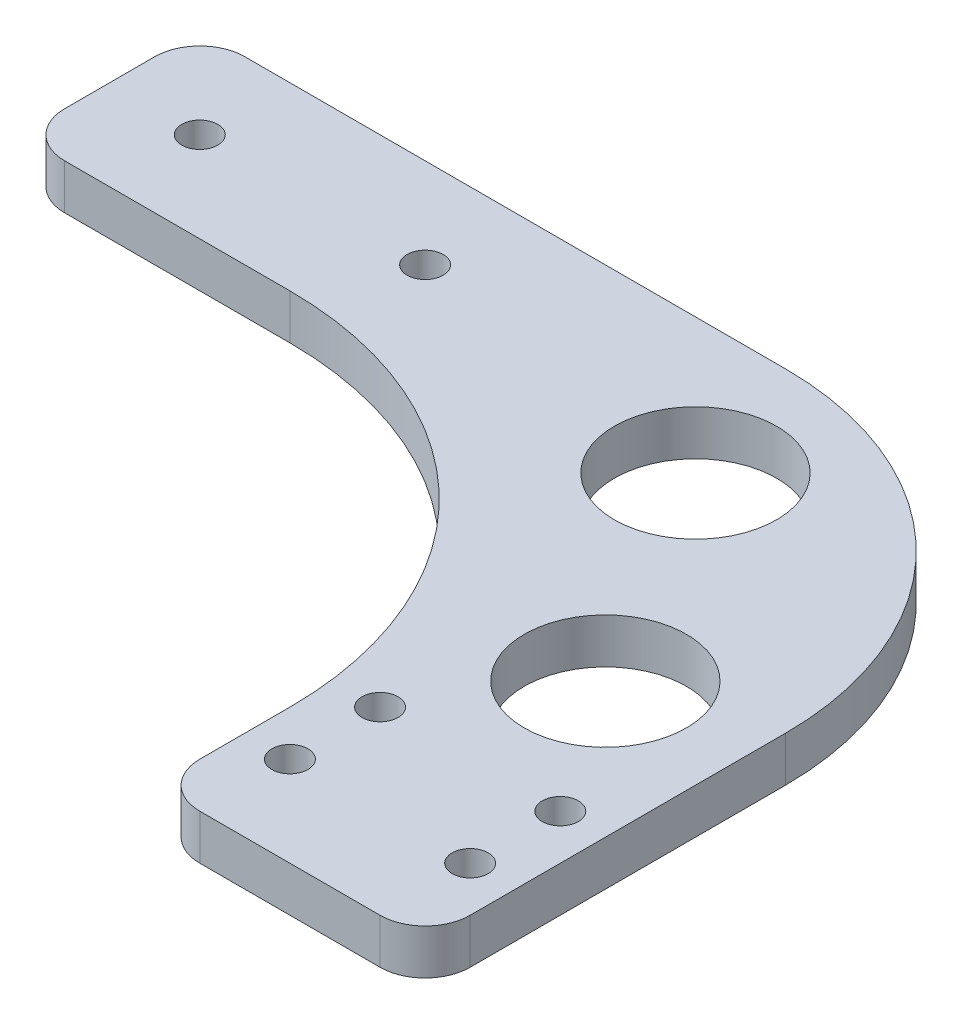
ISO-10303-21;
HEADER;
FILE_DESCRIPTION(('STEP AP214'),'2;1');
FILE_NAME('part.step','',(''),(''),'','','');
FILE_SCHEMA(('AUTOMOTIVE_DESIGN { 1 0 10303 214 1 1 1 1 }'));
ENDSEC;
DATA;
#1=APPLICATION_CONTEXT('core data for automotive mechanical design processes');
#2=APPLICATION_PROTOCOL_DEFINITION('international standard','automotive_design',2000,#1);
#3=PRODUCT_CONTEXT('',#1,'mechanical');
#4=PRODUCT('Part','Part','',(#3));
#5=PRODUCT_RELATED_PRODUCT_CATEGORY('part','',(#4));
#6=PRODUCT_DEFINITION_FORMATION('','',#4);
#7=PRODUCT_DEFINITION_CONTEXT('part definition',#1,'design');
#8=PRODUCT_DEFINITION('design','',#6,#7);
#9=PRODUCT_DEFINITION_SHAPE('','',#8);
#10=(LENGTH_UNIT() NAMED_UNIT(*) SI_UNIT(.MILLI.,.METRE.));
#11=(NAMED_UNIT(*) PLANE_ANGLE_UNIT() SI_UNIT($,.RADIAN.));
#12=(NAMED_UNIT(*) SI_UNIT($,.STERADIAN.) SOLID_ANGLE_UNIT());
#13=UNCERTAINTY_MEASURE_WITH_UNIT(LENGTH_MEASURE(1.E-05),#10,'distance_accuracy_value','');
#14=(GEOMETRIC_REPRESENTATION_CONTEXT(3) GLOBAL_UNCERTAINTY_ASSIGNED_CONTEXT((#13)) GLOBAL_UNIT_ASSIGNED_CONTEXT((#10,
#11,#12)) REPRESENTATION_CONTEXT('',''));
#15=CARTESIAN_POINT('',(0.,0.,0.));
#16=DIRECTION('',(0.,0.,1.));
#17=DIRECTION('',(1.,0.,0.));
#18=AXIS2_PLACEMENT_3D('',#15,#16,#17);
#19=CARTESIAN_POINT('',(-89.6250000000001,5.,-15.375));
#20=DIRECTION('',(1.,0.,0.));
#21=DIRECTION('',(0.,0.,-1.));
#22=AXIS2_PLACEMENT_3D('',#19,#20,#21);
#23=PLANE('',#22);
#24=DIRECTION('',(0.,0.,1.));
#25=VECTOR('',#24,1.);
#26=CARTESIAN_POINT('',(-89.6250000000001,5.,-15.375));
#27=LINE('',#26,#25);
#28=CARTESIAN_POINT('',(-89.6250000000001,5.,-30.375));
#29=VERTEX_POINT('',#28);
#30=CARTESIAN_POINT('',(-89.6250000000001,5.,-20.375));
#31=VERTEX_POINT('',#30);
#32=EDGE_CURVE('E175',#29,#31,#27,.T.);
#33=ORIENTED_EDGE('',*,*,#32,.F.);
#34=DIRECTION('',(0.,-1.,0.));
#35=VECTOR('',#34,1.);
#36=CARTESIAN_POINT('',(-89.6250000000001,5.,-30.375));
#37=LINE('',#36,#35);
#38=CARTESIAN_POINT('',(-89.6250000000001,0.,-30.375));
#39=VERTEX_POINT('',#38);
#40=EDGE_CURVE('E222',#29,#39,#37,.T.);
#41=ORIENTED_EDGE('',*,*,#40,.T.);
#42=DIRECTION('',(0.,0.,1.));
#43=VECTOR('',#42,1.);
#44=CARTESIAN_POINT('',(-89.6250000000001,0.,-15.375));
#45=LINE('',#44,#43);
#46=CARTESIAN_POINT('',(-89.6250000000001,0.,-20.375));
#47=VERTEX_POINT('',#46);
#48=EDGE_CURVE('E167',#39,#47,#45,.T.);
#49=ORIENTED_EDGE('',*,*,#48,.T.);
#50=DIRECTION('',(0.,-1.,0.));
#51=VECTOR('',#50,1.);
#52=CARTESIAN_POINT('',(-89.6250000000001,5.,-20.375));
#53=LINE('',#52,#51);
#54=EDGE_CURVE('E219',#47,#31,#53,.F.);
#55=ORIENTED_EDGE('',*,*,#54,.T.);
#56=EDGE_LOOP('',(#33,#41,#49,#55));
#57=FACE_BOUND('',#56,.T.);
#58=ADVANCED_FACE('F41',(#57),#23,.F.);
#59=CARTESIAN_POINT('',(-19.6250000000001,5.,-15.375));
#60=DIRECTION('',(0.,0.,-1.));
#61=DIRECTION('',(-1.,0.,0.));
#62=AXIS2_PLACEMENT_3D('',#59,#60,#61);
#63=PLANE('',#62);
#64=DIRECTION('',(1.,0.,0.));
#65=VECTOR('',#64,1.);
#66=CARTESIAN_POINT('',(-19.6250000000001,5.,-15.375));
#67=LINE('',#66,#65);
#68=CARTESIAN_POINT('',(-84.6250000000001,5.,-15.375));
#69=VERTEX_POINT('',#68);
#70=CARTESIAN_POINT('',(-59.6250000000001,5.,-15.375));
#71=VERTEX_POINT('',#70);
#72=EDGE_CURVE('E251',#69,#71,#67,.T.);
#73=ORIENTED_EDGE('',*,*,#72,.F.);
#74=DIRECTION('',(0.,-1.,0.));
#75=VECTOR('',#74,1.);
#76=CARTESIAN_POINT('',(-84.6250000000001,5.,-15.375));
#77=LINE('',#76,#75);
#78=CARTESIAN_POINT('',(-84.6250000000001,0.,-15.375));
#79=VERTEX_POINT('',#78);
#80=EDGE_CURVE('E230',#69,#79,#77,.T.);
#81=ORIENTED_EDGE('',*,*,#80,.T.);
#82=DIRECTION('',(1.,0.,0.));
#83=VECTOR('',#82,1.);
#84=CARTESIAN_POINT('',(-19.6250000000001,0.,-15.375));
#85=LINE('',#84,#83);
#86=CARTESIAN_POINT('',(-59.6250000000001,0.,-15.375));
#87=VERTEX_POINT('',#86);
#88=EDGE_CURVE('E160',#79,#87,#85,.T.);
#89=ORIENTED_EDGE('',*,*,#88,.T.);
#90=DIRECTION('',(0.,-1.,0.));
#91=VECTOR('',#90,1.);
#92=CARTESIAN_POINT('',(-59.6250000000001,5.,-15.375));
#93=LINE('',#92,#91);
#94=EDGE_CURVE('E138',#87,#71,#93,.F.);
#95=ORIENTED_EDGE('',*,*,#94,.T.);
#96=EDGE_LOOP('',(#73,#81,#89,#95));
#97=FACE_BOUND('',#96,.T.);
#98=ADVANCED_FACE('F377',(#97),#63,.F.);
#99=CARTESIAN_POINT('',(-19.6250000000001,5.,39.625));
#100=DIRECTION('',(1.,0.,0.));
#101=DIRECTION('',(0.,0.,-1.));
#102=AXIS2_PLACEMENT_3D('',#99,#100,#101);
#103=PLANE('',#102);
#104=DIRECTION('',(0.,0.,1.));
#105=VECTOR('',#104,1.);
#106=CARTESIAN_POINT('',(-19.6250000000001,0.,39.625));
#107=LINE('',#106,#105);
#108=CARTESIAN_POINT('',(-19.6250000000001,0.,24.625));
#109=VERTEX_POINT('',#108);
#110=CARTESIAN_POINT('',(-19.6250000000001,0.,34.625));
#111=VERTEX_POINT('',#110);
#112=EDGE_CURVE('E148',#109,#111,#107,.T.);
#113=ORIENTED_EDGE('',*,*,#112,.T.);
#114=DIRECTION('',(0.,-1.,0.));
#115=VECTOR('',#114,1.);
#116=CARTESIAN_POINT('',(-19.6250000000001,5.,34.625));
#117=LINE('',#116,#115);
#118=CARTESIAN_POINT('',(-19.6250000000001,5.,34.625));
#119=VERTEX_POINT('',#118);
#120=EDGE_CURVE('E216',#111,#119,#117,.F.);
#121=ORIENTED_EDGE('',*,*,#120,.T.);
#122=DIRECTION('',(0.,0.,1.));
#123=VECTOR('',#122,1.);
#124=CARTESIAN_POINT('',(-19.6250000000001,5.,39.625));
#125=LINE('',#124,#123);
#126=CARTESIAN_POINT('',(-19.6250000000001,5.,24.625));
#127=VERTEX_POINT('',#126);
#128=EDGE_CURVE('E151',#127,#119,#125,.T.);
#129=ORIENTED_EDGE('',*,*,#128,.F.);
#130=DIRECTION('',(0.,-1.,0.));
#131=VECTOR('',#130,1.);
#132=CARTESIAN_POINT('',(-19.6250000000001,0.,24.625));
#133=LINE('',#132,#131);
#134=EDGE_CURVE('E136',#127,#109,#133,.T.);
#135=ORIENTED_EDGE('',*,*,#134,.T.);
#136=EDGE_LOOP('',(#113,#121,#129,#135));
#137=FACE_BOUND('',#136,.T.);
#138=ADVANCED_FACE('F147',(#137),#103,.F.);
#139=CARTESIAN_POINT('',(10.3749999999999,5.,39.625));
#140=DIRECTION('',(0.,0.,-1.));
#141=DIRECTION('',(-1.,0.,0.));
#142=AXIS2_PLACEMENT_3D('',#139,#140,#141);
#143=PLANE('',#142);
#144=DIRECTION('',(1.,0.,0.));
#145=VECTOR('',#144,1.);
#146=CARTESIAN_POINT('',(10.3749999999999,0.,39.625));
#147=LINE('',#146,#145);
#148=CARTESIAN_POINT('',(-14.6250000000001,0.,39.625));
#149=VERTEX_POINT('',#148);
#150=CARTESIAN_POINT('',(5.37499999999991,0.,39.625));
#151=VERTEX_POINT('',#150);
#152=EDGE_CURVE('E159',#149,#151,#147,.T.);
#153=ORIENTED_EDGE('',*,*,#152,.T.);
#154=DIRECTION('',(0.,-1.,0.));
#155=VECTOR('',#154,1.);
#156=CARTESIAN_POINT('',(5.37499999999991,5.,39.625));
#157=LINE('',#156,#155);
#158=CARTESIAN_POINT('',(5.37499999999991,5.,39.625));
#159=VERTEX_POINT('',#158);
#160=EDGE_CURVE('E201',#151,#159,#157,.F.);
#161=ORIENTED_EDGE('',*,*,#160,.T.);
#162=DIRECTION('',(1.,0.,0.));
#163=VECTOR('',#162,1.);
#164=CARTESIAN_POINT('',(10.3749999999999,5.,39.625));
#165=LINE('',#164,#163);
#166=CARTESIAN_POINT('',(-14.6250000000001,5.,39.625));
#167=VERTEX_POINT('',#166);
#168=EDGE_CURVE('E245',#167,#159,#165,.T.);
#169=ORIENTED_EDGE('',*,*,#168,.F.);
#170=DIRECTION('',(0.,-1.,0.));
#171=VECTOR('',#170,1.);
#172=CARTESIAN_POINT('',(-14.6250000000001,5.,39.625));
#173=LINE('',#172,#171);
#174=EDGE_CURVE('E197',#167,#149,#173,.T.);
#175=ORIENTED_EDGE('',*,*,#174,.T.);
#176=EDGE_LOOP('',(#153,#161,#169,#175));
#177=FACE_BOUND('',#176,.T.);
#178=ADVANCED_FACE('F384',(#177),#143,.F.);
#179=CARTESIAN_POINT('',(10.3749999999999,5.,-35.375));
#180=DIRECTION('',(-1.,0.,0.));
#181=DIRECTION('',(0.,0.,1.));
#182=AXIS2_PLACEMENT_3D('',#179,#180,#181);
#183=PLANE('',#182);
#184=DIRECTION('',(0.,0.,-1.));
#185=VECTOR('',#184,1.);
#186=CARTESIAN_POINT('',(10.3749999999999,0.,-35.375));
#187=LINE('',#186,#185);
#188=CARTESIAN_POINT('',(10.3749999999999,0.,34.625));
#189=VERTEX_POINT('',#188);
#190=CARTESIAN_POINT('',(10.3749999999999,0.,-0.375000000000007));
#191=VERTEX_POINT('',#190);
#192=EDGE_CURVE('E165',#189,#191,#187,.T.);
#193=ORIENTED_EDGE('',*,*,#192,.T.);
#194=DIRECTION('',(0.,-1.,0.));
#195=VECTOR('',#194,1.);
#196=CARTESIAN_POINT('',(10.3749999999999,5.,-0.375000000000007));
#197=LINE('',#196,#195);
#198=CARTESIAN_POINT('',(10.3749999999999,5.,-0.375000000000007));
#199=VERTEX_POINT('',#198);
#200=EDGE_CURVE('E50',#191,#199,#197,.F.);
#201=ORIENTED_EDGE('',*,*,#200,.T.);
#202=DIRECTION('',(0.,0.,-1.));
#203=VECTOR('',#202,1.);
#204=CARTESIAN_POINT('',(10.3749999999999,5.,-35.375));
#205=LINE('',#204,#203);
#206=CARTESIAN_POINT('',(10.3749999999999,5.,34.625));
#207=VERTEX_POINT('',#206);
#208=EDGE_CURVE('E242',#207,#199,#205,.T.);
#209=ORIENTED_EDGE('',*,*,#208,.F.);
#210=DIRECTION('',(0.,-1.,0.));
#211=VECTOR('',#210,1.);
#212=CARTESIAN_POINT('',(10.3749999999999,5.,34.625));
#213=LINE('',#212,#211);
#214=EDGE_CURVE('E181',#207,#189,#213,.T.);
#215=ORIENTED_EDGE('',*,*,#214,.T.);
#216=EDGE_LOOP('',(#193,#201,#209,#215));
#217=FACE_BOUND('',#216,.T.);
#218=ADVANCED_FACE('F388',(#217),#183,.F.);
#219=CARTESIAN_POINT('',(-89.6250000000001,5.,-35.375));
#220=DIRECTION('',(0.,0.,1.));
#221=DIRECTION('',(1.,0.,0.));
#222=AXIS2_PLACEMENT_3D('',#219,#220,#221);
#223=PLANE('',#222);
#224=DIRECTION('',(-1.,0.,0.));
#225=VECTOR('',#224,1.);
#226=CARTESIAN_POINT('',(-89.6250000000001,5.,-35.375));
#227=LINE('',#226,#225);
#228=CARTESIAN_POINT('',(-24.6250000000001,5.,-35.375));
#229=VERTEX_POINT('',#228);
#230=CARTESIAN_POINT('',(-84.6250000000001,5.,-35.375));
#231=VERTEX_POINT('',#230);
#232=EDGE_CURVE('E153',#229,#231,#227,.T.);
#233=ORIENTED_EDGE('',*,*,#232,.F.);
#234=DIRECTION('',(0.,-1.,0.));
#235=VECTOR('',#234,1.);
#236=CARTESIAN_POINT('',(-24.6250000000001,5.,-35.375));
#237=LINE('',#236,#235);
#238=CARTESIAN_POINT('',(-24.6250000000001,0.,-35.375));
#239=VERTEX_POINT('',#238);
#240=EDGE_CURVE('E234',#229,#239,#237,.T.);
#241=ORIENTED_EDGE('',*,*,#240,.T.);
#242=DIRECTION('',(-1.,0.,0.));
#243=VECTOR('',#242,1.);
#244=CARTESIAN_POINT('',(-89.6250000000001,0.,-35.375));
#245=LINE('',#244,#243);
#246=CARTESIAN_POINT('',(-84.6250000000001,0.,-35.375));
#247=VERTEX_POINT('',#246);
#248=EDGE_CURVE('E173',#239,#247,#245,.T.);
#249=ORIENTED_EDGE('',*,*,#248,.T.);
#250=DIRECTION('',(0.,-1.,0.));
#251=VECTOR('',#250,1.);
#252=CARTESIAN_POINT('',(-84.6250000000001,5.,-35.375));
#253=LINE('',#252,#251);
#254=EDGE_CURVE('E226',#247,#231,#253,.F.);
#255=ORIENTED_EDGE('',*,*,#254,.T.);
#256=EDGE_LOOP('',(#233,#241,#249,#255));
#257=FACE_BOUND('',#256,.T.);
#258=ADVANCED_FACE('F345',(#257),#223,.F.);
#259=CARTESIAN_POINT('',(0.,5.,0.));
#260=DIRECTION('',(0.,-1.,0.));
#261=DIRECTION('',(0.,0.,-1.));
#262=AXIS2_PLACEMENT_3D('',#259,#260,#261);
#263=PLANE('',#262);
#264=CARTESIAN_POINT('',(-54.6250000000001,5.,-25.375));
#265=DIRECTION('',(0.,1.,0.));
#266=DIRECTION('',(0.,0.,1.));
#267=AXIS2_PLACEMENT_3D('',#264,#265,#266);
#268=CIRCLE('',#267,2.);
#269=CARTESIAN_POINT('',(-54.6250000000001,5.,-23.375));
#270=VERTEX_POINT('',#269);
#271=EDGE_CURVE('E325',#270,#270,#268,.T.);
#272=ORIENTED_EDGE('',*,*,#271,.F.);
#273=EDGE_LOOP('',(#272));
#274=FACE_BOUND('',#273,.T.);
#275=CARTESIAN_POINT('',(-79.6250000000001,5.,-25.375));
#276=DIRECTION('',(0.,1.,0.));
#277=DIRECTION('',(0.,0.,1.));
#278=AXIS2_PLACEMENT_3D('',#275,#276,#277);
#279=CIRCLE('',#278,2.);
#280=CARTESIAN_POINT('',(-79.6250000000001,5.,-23.375));
#281=VERTEX_POINT('',#280);
#282=EDGE_CURVE('E317',#281,#281,#279,.T.);
#283=ORIENTED_EDGE('',*,*,#282,.F.);
#284=EDGE_LOOP('',(#283));
#285=FACE_BOUND('',#284,.T.);
#286=CARTESIAN_POINT('',(-4.62500000000009,5.,4.62499999999998));
#287=DIRECTION('',(0.,1.,0.));
#288=DIRECTION('',(0.,0.,1.));
#289=AXIS2_PLACEMENT_3D('',#286,#287,#288);
#290=CIRCLE('',#289,9.);
#291=CARTESIAN_POINT('',(-4.62500000000009,5.,13.625));
#292=VERTEX_POINT('',#291);
#293=EDGE_CURVE('E309',#292,#292,#290,.T.);
#294=ORIENTED_EDGE('',*,*,#293,.F.);
#295=EDGE_LOOP('',(#294));
#296=FACE_BOUND('',#295,.T.);
#297=CARTESIAN_POINT('',(-19.6250000000001,5.,-20.375));
#298=DIRECTION('',(0.,1.,0.));
#299=DIRECTION('',(0.,0.,1.));
#300=AXIS2_PLACEMENT_3D('',#297,#298,#299);
#301=CIRCLE('',#300,9.);
#302=CARTESIAN_POINT('',(-19.6250000000001,5.,-11.375));
#303=VERTEX_POINT('',#302);
#304=EDGE_CURVE('E301',#303,#303,#301,.T.);
#305=ORIENTED_EDGE('',*,*,#304,.F.);
#306=EDGE_LOOP('',(#305));
#307=FACE_BOUND('',#306,.T.);
#308=CARTESIAN_POINT('',(5.37499999999991,5.,29.625));
#309=DIRECTION('',(0.,1.,0.));
#310=DIRECTION('',(0.,0.,1.));
#311=AXIS2_PLACEMENT_3D('',#308,#309,#310);
#312=CIRCLE('',#311,2.);
#313=CARTESIAN_POINT('',(5.37499999999991,5.,31.625));
#314=VERTEX_POINT('',#313);
#315=EDGE_CURVE('E294',#314,#314,#312,.T.);
#316=ORIENTED_EDGE('',*,*,#315,.F.);
#317=EDGE_LOOP('',(#316));
#318=FACE_BOUND('',#317,.T.);
#319=CARTESIAN_POINT('',(5.3749999999999,5.,19.625));
#320=DIRECTION('',(0.,1.,0.));
#321=DIRECTION('',(0.,0.,1.));
#322=AXIS2_PLACEMENT_3D('',#319,#320,#321);
#323=CIRCLE('',#322,2.);
#324=CARTESIAN_POINT('',(5.3749999999999,5.,21.625));
#325=VERTEX_POINT('',#324);
#326=EDGE_CURVE('E286',#325,#325,#323,.T.);
#327=ORIENTED_EDGE('',*,*,#326,.F.);
#328=EDGE_LOOP('',(#327));
#329=FACE_BOUND('',#328,.T.);
#330=CARTESIAN_POINT('',(-14.6250000000001,5.,19.625));
#331=DIRECTION('',(0.,1.,0.));
#332=DIRECTION('',(0.,0.,1.));
#333=AXIS2_PLACEMENT_3D('',#330,#331,#332);
#334=CIRCLE('',#333,2.);
#335=CARTESIAN_POINT('',(-14.6250000000001,5.,21.625));
#336=VERTEX_POINT('',#335);
#337=EDGE_CURVE('E277',#336,#336,#334,.T.);
#338=ORIENTED_EDGE('',*,*,#337,.F.);
#339=EDGE_LOOP('',(#338));
#340=FACE_BOUND('',#339,.T.);
#341=CARTESIAN_POINT('',(-14.6250000000001,5.,29.625));
#342=DIRECTION('',(0.,1.,0.));
#343=DIRECTION('',(0.,0.,1.));
#344=AXIS2_PLACEMENT_3D('',#341,#342,#343);
#345=CIRCLE('',#344,2.);
#346=CARTESIAN_POINT('',(-14.6250000000001,5.,31.625));
#347=VERTEX_POINT('',#346);
#348=EDGE_CURVE('E261',#347,#347,#345,.T.);
#349=ORIENTED_EDGE('',*,*,#348,.F.);
#350=EDGE_LOOP('',(#349));
#351=FACE_BOUND('',#350,.T.);
#352=ORIENTED_EDGE('',*,*,#208,.T.);
#353=CARTESIAN_POINT('',(-24.6250000000001,5.,-0.375));
#354=DIRECTION('',(0.,-1.,0.));
#355=DIRECTION('',(0.,0.,-1.));
#356=AXIS2_PLACEMENT_3D('',#353,#354,#355);
#357=CIRCLE('',#356,35.);
#358=EDGE_CURVE('E11',#199,#229,#357,.F.);
#359=ORIENTED_EDGE('',*,*,#358,.T.);
#360=ORIENTED_EDGE('',*,*,#232,.T.);
#361=CARTESIAN_POINT('',(-84.6250000000001,5.,-30.375));
#362=DIRECTION('',(0.,-1.,0.));
#363=DIRECTION('',(0.,0.,-1.));
#364=AXIS2_PLACEMENT_3D('',#361,#362,#363);
#365=CIRCLE('',#364,5.);
#366=EDGE_CURVE('E207',#231,#29,#365,.F.);
#367=ORIENTED_EDGE('',*,*,#366,.T.);
#368=ORIENTED_EDGE('',*,*,#32,.T.);
#369=CARTESIAN_POINT('',(-84.6250000000001,5.,-20.375));
#370=DIRECTION('',(0.,-1.,0.));
#371=DIRECTION('',(0.,0.,-1.));
#372=AXIS2_PLACEMENT_3D('',#369,#370,#371);
#373=CIRCLE('',#372,5.);
#374=EDGE_CURVE('E204',#31,#69,#373,.F.);
#375=ORIENTED_EDGE('',*,*,#374,.T.);
#376=ORIENTED_EDGE('',*,*,#72,.T.);
#377=CARTESIAN_POINT('',(-59.6250000000001,5.,24.625));
#378=DIRECTION('',(0.,-1.,0.));
#379=DIRECTION('',(0.,0.,-1.));
#380=AXIS2_PLACEMENT_3D('',#377,#378,#379);
#381=CIRCLE('',#380,40.);
#382=EDGE_CURVE('E142',#71,#127,#381,.T.);
#383=ORIENTED_EDGE('',*,*,#382,.T.);
#384=ORIENTED_EDGE('',*,*,#128,.T.);
#385=CARTESIAN_POINT('',(-14.6250000000001,5.,34.625));
#386=DIRECTION('',(0.,-1.,0.));
#387=DIRECTION('',(0.,0.,-1.));
#388=AXIS2_PLACEMENT_3D('',#385,#386,#387);
#389=CIRCLE('',#388,5.);
#390=EDGE_CURVE('E210',#119,#167,#389,.F.);
#391=ORIENTED_EDGE('',*,*,#390,.T.);
#392=ORIENTED_EDGE('',*,*,#168,.T.);
#393=CARTESIAN_POINT('',(5.37499999999991,5.,34.625));
#394=DIRECTION('',(0.,-1.,0.));
#395=DIRECTION('',(0.,0.,-1.));
#396=AXIS2_PLACEMENT_3D('',#393,#394,#395);
#397=CIRCLE('',#396,5.);
#398=EDGE_CURVE('E213',#159,#207,#397,.F.);
#399=ORIENTED_EDGE('',*,*,#398,.T.);
#400=EDGE_LOOP('',(#352,#359,#360,#367,#368,#375,#376,#383,#384,#391,#392,#399));
#401=FACE_BOUND('',#400,.T.);
#402=ADVANCED_FACE('F342',(#274,#285,#296,#307,#318,#329,#340,#351,#401),#263,.F.);
#403=CARTESIAN_POINT('',(0.,0.,0.));
#404=DIRECTION('',(0.,-1.,0.));
#405=DIRECTION('',(0.,0.,-1.));
#406=AXIS2_PLACEMENT_3D('',#403,#404,#405);
#407=PLANE('',#406);
#408=CARTESIAN_POINT('',(-54.6250000000001,0.,-25.375));
#409=DIRECTION('',(0.,1.,0.));
#410=DIRECTION('',(0.,0.,1.));
#411=AXIS2_PLACEMENT_3D('',#408,#409,#410);
#412=CIRCLE('',#411,2.);
#413=CARTESIAN_POINT('',(-54.6250000000001,0.,-23.375));
#414=VERTEX_POINT('',#413);
#415=EDGE_CURVE('E321',#414,#414,#412,.T.);
#416=ORIENTED_EDGE('',*,*,#415,.T.);
#417=EDGE_LOOP('',(#416));
#418=FACE_BOUND('',#417,.T.);
#419=CARTESIAN_POINT('',(-79.6250000000001,0.,-25.375));
#420=DIRECTION('',(0.,1.,0.));
#421=DIRECTION('',(0.,0.,1.));
#422=AXIS2_PLACEMENT_3D('',#419,#420,#421);
#423=CIRCLE('',#422,2.);
#424=CARTESIAN_POINT('',(-79.6250000000001,0.,-23.375));
#425=VERTEX_POINT('',#424);
#426=EDGE_CURVE('E313',#425,#425,#423,.T.);
#427=ORIENTED_EDGE('',*,*,#426,.T.);
#428=EDGE_LOOP('',(#427));
#429=FACE_BOUND('',#428,.T.);
#430=CARTESIAN_POINT('',(-4.62500000000009,0.,4.62499999999998));
#431=DIRECTION('',(0.,1.,0.));
#432=DIRECTION('',(0.,0.,1.));
#433=AXIS2_PLACEMENT_3D('',#430,#431,#432);
#434=CIRCLE('',#433,9.);
#435=CARTESIAN_POINT('',(-4.62500000000009,0.,13.625));
#436=VERTEX_POINT('',#435);
#437=EDGE_CURVE('E305',#436,#436,#434,.T.);
#438=ORIENTED_EDGE('',*,*,#437,.T.);
#439=EDGE_LOOP('',(#438));
#440=FACE_BOUND('',#439,.T.);
#441=CARTESIAN_POINT('',(-19.6250000000001,0.,-20.375));
#442=DIRECTION('',(0.,1.,0.));
#443=DIRECTION('',(0.,0.,1.));
#444=AXIS2_PLACEMENT_3D('',#441,#442,#443);
#445=CIRCLE('',#444,9.);
#446=CARTESIAN_POINT('',(-19.6250000000001,0.,-11.375));
#447=VERTEX_POINT('',#446);
#448=EDGE_CURVE('E282',#447,#447,#445,.T.);
#449=ORIENTED_EDGE('',*,*,#448,.T.);
#450=EDGE_LOOP('',(#449));
#451=FACE_BOUND('',#450,.T.);
#452=CARTESIAN_POINT('',(5.37499999999991,0.,29.625));
#453=DIRECTION('',(0.,1.,0.));
#454=DIRECTION('',(0.,0.,1.));
#455=AXIS2_PLACEMENT_3D('',#452,#453,#454);
#456=CIRCLE('',#455,2.);
#457=CARTESIAN_POINT('',(5.37499999999991,0.,31.625));
#458=VERTEX_POINT('',#457);
#459=EDGE_CURVE('E275',#458,#458,#456,.T.);
#460=ORIENTED_EDGE('',*,*,#459,.T.);
#461=EDGE_LOOP('',(#460));
#462=FACE_BOUND('',#461,.T.);
#463=CARTESIAN_POINT('',(5.3749999999999,0.,19.625));
#464=DIRECTION('',(0.,1.,0.));
#465=DIRECTION('',(0.,0.,1.));
#466=AXIS2_PLACEMENT_3D('',#463,#464,#465);
#467=CIRCLE('',#466,2.);
#468=CARTESIAN_POINT('',(5.3749999999999,0.,21.625));
#469=VERTEX_POINT('',#468);
#470=EDGE_CURVE('E290',#469,#469,#467,.T.);
#471=ORIENTED_EDGE('',*,*,#470,.T.);
#472=EDGE_LOOP('',(#471));
#473=FACE_BOUND('',#472,.T.);
#474=CARTESIAN_POINT('',(-14.6250000000001,0.,19.625));
#475=DIRECTION('',(0.,1.,0.));
#476=DIRECTION('',(0.,0.,1.));
#477=AXIS2_PLACEMENT_3D('',#474,#475,#476);
#478=CIRCLE('',#477,2.);
#479=CARTESIAN_POINT('',(-14.6250000000001,0.,21.625));
#480=VERTEX_POINT('',#479);
#481=EDGE_CURVE('E281',#480,#480,#478,.T.);
#482=ORIENTED_EDGE('',*,*,#481,.T.);
#483=EDGE_LOOP('',(#482));
#484=FACE_BOUND('',#483,.T.);
#485=CARTESIAN_POINT('',(-14.6250000000001,0.,29.625));
#486=DIRECTION('',(0.,1.,0.));
#487=DIRECTION('',(0.,0.,1.));
#488=AXIS2_PLACEMENT_3D('',#485,#486,#487);
#489=CIRCLE('',#488,2.);
#490=CARTESIAN_POINT('',(-14.6250000000001,0.,31.625));
#491=VERTEX_POINT('',#490);
#492=EDGE_CURVE('E265',#491,#491,#489,.T.);
#493=ORIENTED_EDGE('',*,*,#492,.T.);
#494=EDGE_LOOP('',(#493));
#495=FACE_BOUND('',#494,.T.);
#496=ORIENTED_EDGE('',*,*,#248,.F.);
#497=CARTESIAN_POINT('',(-24.6250000000001,0.,-0.375));
#498=DIRECTION('',(0.,-1.,0.));
#499=DIRECTION('',(0.,0.,-1.));
#500=AXIS2_PLACEMENT_3D('',#497,#498,#499);
#501=CIRCLE('',#500,35.);
#502=EDGE_CURVE('E64',#239,#191,#501,.T.);
#503=ORIENTED_EDGE('',*,*,#502,.T.);
#504=ORIENTED_EDGE('',*,*,#192,.F.);
#505=CARTESIAN_POINT('',(5.37499999999991,0.,34.625));
#506=DIRECTION('',(0.,-1.,0.));
#507=DIRECTION('',(0.,0.,-1.));
#508=AXIS2_PLACEMENT_3D('',#505,#506,#507);
#509=CIRCLE('',#508,5.);
#510=EDGE_CURVE('E194',#189,#151,#509,.T.);
#511=ORIENTED_EDGE('',*,*,#510,.T.);
#512=ORIENTED_EDGE('',*,*,#152,.F.);
#513=CARTESIAN_POINT('',(-14.6250000000001,0.,34.625));
#514=DIRECTION('',(0.,-1.,0.));
#515=DIRECTION('',(0.,0.,-1.));
#516=AXIS2_PLACEMENT_3D('',#513,#514,#515);
#517=CIRCLE('',#516,5.);
#518=EDGE_CURVE('E157',#149,#111,#517,.T.);
#519=ORIENTED_EDGE('',*,*,#518,.T.);
#520=ORIENTED_EDGE('',*,*,#112,.F.);
#521=CARTESIAN_POINT('',(-59.6250000000001,0.,24.625));
#522=DIRECTION('',(0.,-1.,0.));
#523=DIRECTION('',(0.,0.,-1.));
#524=AXIS2_PLACEMENT_3D('',#521,#522,#523);
#525=CIRCLE('',#524,40.);
#526=EDGE_CURVE('E132',#109,#87,#525,.F.);
#527=ORIENTED_EDGE('',*,*,#526,.T.);
#528=ORIENTED_EDGE('',*,*,#88,.F.);
#529=CARTESIAN_POINT('',(-84.6250000000001,0.,-20.375));
#530=DIRECTION('',(0.,-1.,0.));
#531=DIRECTION('',(0.,0.,-1.));
#532=AXIS2_PLACEMENT_3D('',#529,#530,#531);
#533=CIRCLE('',#532,5.);
#534=EDGE_CURVE('E185',#79,#47,#533,.T.);
#535=ORIENTED_EDGE('',*,*,#534,.T.);
#536=ORIENTED_EDGE('',*,*,#48,.F.);
#537=CARTESIAN_POINT('',(-84.6250000000001,0.,-30.375));
#538=DIRECTION('',(0.,-1.,0.));
#539=DIRECTION('',(0.,0.,-1.));
#540=AXIS2_PLACEMENT_3D('',#537,#538,#539);
#541=CIRCLE('',#540,5.);
#542=EDGE_CURVE('E188',#39,#247,#541,.T.);
#543=ORIENTED_EDGE('',*,*,#542,.T.);
#544=EDGE_LOOP('',(#496,#503,#504,#511,#512,#519,#520,#527,#528,#535,#536,#543));
#545=FACE_BOUND('',#544,.T.);
#546=ADVANCED_FACE('F155',(#418,#429,#440,#451,#462,#473,#484,#495,#545),#407,.T.);
#547=CARTESIAN_POINT('',(-59.6250000000001,5.,24.625));
#548=DIRECTION('',(0.,1.,0.));
#549=DIRECTION('',(0.,0.,1.));
#550=AXIS2_PLACEMENT_3D('',#547,#548,#549);
#551=CYLINDRICAL_SURFACE('',#550,40.);
#552=ORIENTED_EDGE('',*,*,#382,.F.);
#553=ORIENTED_EDGE('',*,*,#94,.F.);
#554=ORIENTED_EDGE('',*,*,#526,.F.);
#555=ORIENTED_EDGE('',*,*,#134,.F.);
#556=EDGE_LOOP('',(#552,#553,#554,#555));
#557=FACE_BOUND('',#556,.T.);
#558=ADVANCED_FACE('F135',(#557),#551,.F.);
#559=CARTESIAN_POINT('',(5.37499999999991,5.,34.625));
#560=DIRECTION('',(0.,-1.,0.));
#561=DIRECTION('',(0.,0.,-1.));
#562=AXIS2_PLACEMENT_3D('',#559,#560,#561);
#563=CYLINDRICAL_SURFACE('',#562,5.);
#564=ORIENTED_EDGE('',*,*,#398,.F.);
#565=ORIENTED_EDGE('',*,*,#160,.F.);
#566=ORIENTED_EDGE('',*,*,#510,.F.);
#567=ORIENTED_EDGE('',*,*,#214,.F.);
#568=EDGE_LOOP('',(#564,#565,#566,#567));
#569=FACE_BOUND('',#568,.T.);
#570=ADVANCED_FACE('F387',(#569),#563,.T.);
#571=CARTESIAN_POINT('',(-14.6250000000001,5.,34.625));
#572=DIRECTION('',(0.,-1.,0.));
#573=DIRECTION('',(0.,0.,-1.));
#574=AXIS2_PLACEMENT_3D('',#571,#572,#573);
#575=CYLINDRICAL_SURFACE('',#574,5.);
#576=ORIENTED_EDGE('',*,*,#390,.F.);
#577=ORIENTED_EDGE('',*,*,#120,.F.);
#578=ORIENTED_EDGE('',*,*,#518,.F.);
#579=ORIENTED_EDGE('',*,*,#174,.F.);
#580=EDGE_LOOP('',(#576,#577,#578,#579));
#581=FACE_BOUND('',#580,.T.);
#582=ADVANCED_FACE('F382',(#581),#575,.T.);
#583=CARTESIAN_POINT('',(-84.6250000000001,5.,-30.375));
#584=DIRECTION('',(0.,-1.,0.));
#585=DIRECTION('',(0.,0.,-1.));
#586=AXIS2_PLACEMENT_3D('',#583,#584,#585);
#587=CYLINDRICAL_SURFACE('',#586,5.);
#588=ORIENTED_EDGE('',*,*,#366,.F.);
#589=ORIENTED_EDGE('',*,*,#254,.F.);
#590=ORIENTED_EDGE('',*,*,#542,.F.);
#591=ORIENTED_EDGE('',*,*,#40,.F.);
#592=EDGE_LOOP('',(#588,#589,#590,#591));
#593=FACE_BOUND('',#592,.T.);
#594=ADVANCED_FACE('F371',(#593),#587,.T.);
#595=CARTESIAN_POINT('',(-84.6250000000001,5.,-20.375));
#596=DIRECTION('',(0.,-1.,0.));
#597=DIRECTION('',(0.,0.,-1.));
#598=AXIS2_PLACEMENT_3D('',#595,#596,#597);
#599=CYLINDRICAL_SURFACE('',#598,5.);
#600=ORIENTED_EDGE('',*,*,#374,.F.);
#601=ORIENTED_EDGE('',*,*,#54,.F.);
#602=ORIENTED_EDGE('',*,*,#534,.F.);
#603=ORIENTED_EDGE('',*,*,#80,.F.);
#604=EDGE_LOOP('',(#600,#601,#602,#603));
#605=FACE_BOUND('',#604,.T.);
#606=ADVANCED_FACE('F373',(#605),#599,.T.);
#607=CARTESIAN_POINT('',(-14.6250000000001,0.,29.625));
#608=DIRECTION('',(0.,1.,0.));
#609=DIRECTION('',(0.,0.,1.));
#610=AXIS2_PLACEMENT_3D('',#607,#608,#609);
#611=CYLINDRICAL_SURFACE('',#610,2.);
#612=ORIENTED_EDGE('',*,*,#492,.F.);
#613=EDGE_LOOP('',(#612));
#614=FACE_BOUND('',#613,.T.);
#615=ORIENTED_EDGE('',*,*,#348,.T.);
#616=EDGE_LOOP('',(#615));
#617=FACE_BOUND('',#616,.T.);
#618=ADVANCED_FACE('F413',(#614,#617),#611,.F.);
#619=CARTESIAN_POINT('',(-14.6250000000001,0.,19.625));
#620=DIRECTION('',(0.,1.,0.));
#621=DIRECTION('',(0.,0.,1.));
#622=AXIS2_PLACEMENT_3D('',#619,#620,#621);
#623=CYLINDRICAL_SURFACE('',#622,2.);
#624=ORIENTED_EDGE('',*,*,#481,.F.);
#625=EDGE_LOOP('',(#624));
#626=FACE_BOUND('',#625,.T.);
#627=ORIENTED_EDGE('',*,*,#337,.T.);
#628=EDGE_LOOP('',(#627));
#629=FACE_BOUND('',#628,.T.);
#630=ADVANCED_FACE('F417',(#626,#629),#623,.F.);
#631=CARTESIAN_POINT('',(5.3749999999999,0.,19.625));
#632=DIRECTION('',(0.,1.,0.));
#633=DIRECTION('',(0.,0.,1.));
#634=AXIS2_PLACEMENT_3D('',#631,#632,#633);
#635=CYLINDRICAL_SURFACE('',#634,2.);
#636=ORIENTED_EDGE('',*,*,#470,.F.);
#637=EDGE_LOOP('',(#636));
#638=FACE_BOUND('',#637,.T.);
#639=ORIENTED_EDGE('',*,*,#326,.T.);
#640=EDGE_LOOP('',(#639));
#641=FACE_BOUND('',#640,.T.);
#642=ADVANCED_FACE('F423',(#638,#641),#635,.F.);
#643=CARTESIAN_POINT('',(5.37499999999991,0.,29.625));
#644=DIRECTION('',(0.,1.,0.));
#645=DIRECTION('',(0.,0.,1.));
#646=AXIS2_PLACEMENT_3D('',#643,#644,#645);
#647=CYLINDRICAL_SURFACE('',#646,2.);
#648=ORIENTED_EDGE('',*,*,#459,.F.);
#649=EDGE_LOOP('',(#648));
#650=FACE_BOUND('',#649,.T.);
#651=ORIENTED_EDGE('',*,*,#315,.T.);
#652=EDGE_LOOP('',(#651));
#653=FACE_BOUND('',#652,.T.);
#654=ADVANCED_FACE('F475',(#650,#653),#647,.F.);
#655=CARTESIAN_POINT('',(-24.6250000000001,5.,-0.375));
#656=DIRECTION('',(0.,-1.,0.));
#657=DIRECTION('',(0.,0.,-1.));
#658=AXIS2_PLACEMENT_3D('',#655,#656,#657);
#659=CYLINDRICAL_SURFACE('',#658,35.);
#660=ORIENTED_EDGE('',*,*,#358,.F.);
#661=ORIENTED_EDGE('',*,*,#200,.F.);
#662=ORIENTED_EDGE('',*,*,#502,.F.);
#663=ORIENTED_EDGE('',*,*,#240,.F.);
#664=EDGE_LOOP('',(#660,#661,#662,#663));
#665=FACE_BOUND('',#664,.T.);
#666=ADVANCED_FACE('F43',(#665),#659,.T.);
#667=CARTESIAN_POINT('',(-19.6250000000001,0.,-20.375));
#668=DIRECTION('',(0.,1.,0.));
#669=DIRECTION('',(0.,0.,1.));
#670=AXIS2_PLACEMENT_3D('',#667,#668,#669);
#671=CYLINDRICAL_SURFACE('',#670,9.);
#672=ORIENTED_EDGE('',*,*,#448,.F.);
#673=EDGE_LOOP('',(#672));
#674=FACE_BOUND('',#673,.T.);
#675=ORIENTED_EDGE('',*,*,#304,.T.);
#676=EDGE_LOOP('',(#675));
#677=FACE_BOUND('',#676,.T.);
#678=ADVANCED_FACE('F508',(#674,#677),#671,.F.);
#679=CARTESIAN_POINT('',(-4.62500000000009,0.,4.62499999999998));
#680=DIRECTION('',(0.,1.,0.));
#681=DIRECTION('',(0.,0.,1.));
#682=AXIS2_PLACEMENT_3D('',#679,#680,#681);
#683=CYLINDRICAL_SURFACE('',#682,9.);
#684=ORIENTED_EDGE('',*,*,#437,.F.);
#685=EDGE_LOOP('',(#684));
#686=FACE_BOUND('',#685,.T.);
#687=ORIENTED_EDGE('',*,*,#293,.T.);
#688=EDGE_LOOP('',(#687));
#689=FACE_BOUND('',#688,.T.);
#690=ADVANCED_FACE('F516',(#686,#689),#683,.F.);
#691=CARTESIAN_POINT('',(-79.6250000000001,0.,-25.375));
#692=DIRECTION('',(0.,1.,0.));
#693=DIRECTION('',(0.,0.,1.));
#694=AXIS2_PLACEMENT_3D('',#691,#692,#693);
#695=CYLINDRICAL_SURFACE('',#694,2.);
#696=ORIENTED_EDGE('',*,*,#426,.F.);
#697=EDGE_LOOP('',(#696));
#698=FACE_BOUND('',#697,.T.);
#699=ORIENTED_EDGE('',*,*,#282,.T.);
#700=EDGE_LOOP('',(#699));
#701=FACE_BOUND('',#700,.T.);
#702=ADVANCED_FACE('F338',(#698,#701),#695,.F.);
#703=CARTESIAN_POINT('',(-54.6250000000001,0.,-25.375));
#704=DIRECTION('',(0.,1.,0.));
#705=DIRECTION('',(0.,0.,1.));
#706=AXIS2_PLACEMENT_3D('',#703,#704,#705);
#707=CYLINDRICAL_SURFACE('',#706,2.);
#708=ORIENTED_EDGE('',*,*,#415,.F.);
#709=EDGE_LOOP('',(#708));
#710=FACE_BOUND('',#709,.T.);
#711=ORIENTED_EDGE('',*,*,#271,.T.);
#712=EDGE_LOOP('',(#711));
#713=FACE_BOUND('',#712,.T.);
#714=ADVANCED_FACE('F335',(#710,#713),#707,.F.);
#715=CLOSED_SHELL('',(#58,#98,#138,#178,#218,#258,#402,#546,#558,#570,#582,#594,#606,#618,#630,
#642,#654,#666,#678,#690,#702,#714));
#716=MANIFOLD_SOLID_BREP('B2',#715);
#717=ADVANCED_BREP_SHAPE_REPRESENTATION('',(#18,#716),#14);
#718=SHAPE_DEFINITION_REPRESENTATION(#9,#717);
ENDSEC;
END-ISO-10303-21;
